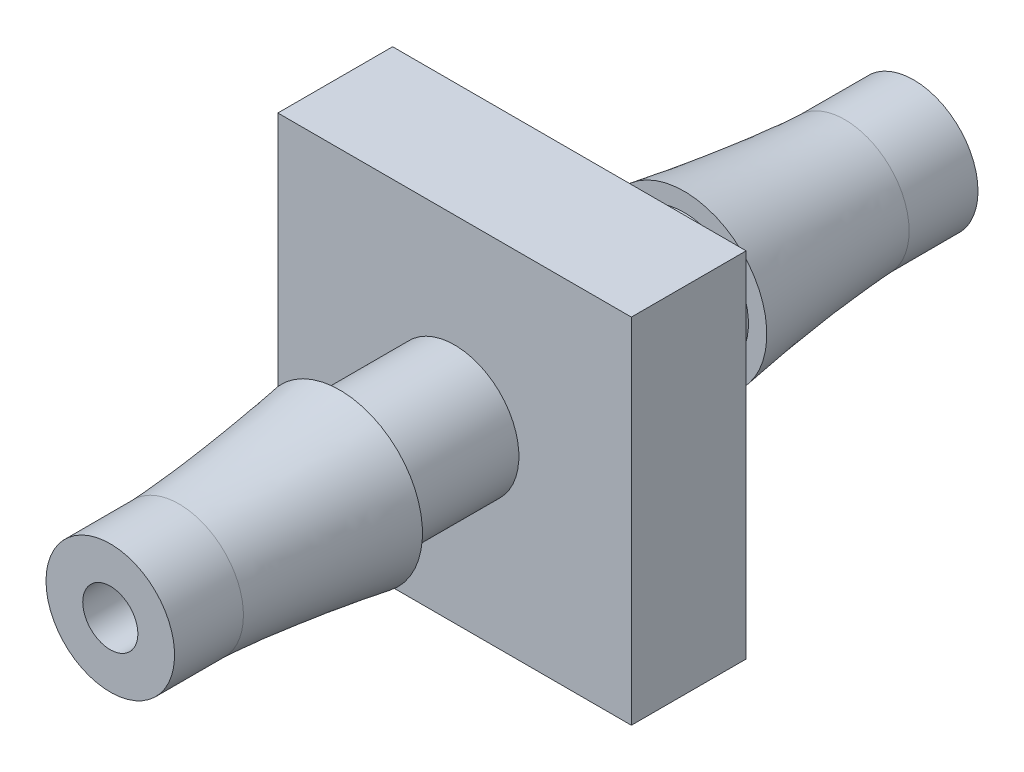
ISO-10303-21;
HEADER;
FILE_DESCRIPTION(('STEP AP214'),'2;1');
FILE_NAME('part.step','',(''),(''),'','','');
FILE_SCHEMA(('AUTOMOTIVE_DESIGN { 1 0 10303 214 1 1 1 1 }'));
ENDSEC;
DATA;
#1=APPLICATION_CONTEXT('core data for automotive mechanical design processes');
#2=APPLICATION_PROTOCOL_DEFINITION('international standard','automotive_design',2000,#1);
#3=PRODUCT_CONTEXT('',#1,'mechanical');
#4=PRODUCT('Part','Part','',(#3));
#5=PRODUCT_RELATED_PRODUCT_CATEGORY('part','',(#4));
#6=PRODUCT_DEFINITION_FORMATION('','',#4);
#7=PRODUCT_DEFINITION_CONTEXT('part definition',#1,'design');
#8=PRODUCT_DEFINITION('design','',#6,#7);
#9=PRODUCT_DEFINITION_SHAPE('','',#8);
#10=(LENGTH_UNIT() NAMED_UNIT(*) SI_UNIT(.MILLI.,.METRE.));
#11=(NAMED_UNIT(*) PLANE_ANGLE_UNIT() SI_UNIT($,.RADIAN.));
#12=(NAMED_UNIT(*) SI_UNIT($,.STERADIAN.) SOLID_ANGLE_UNIT());
#13=UNCERTAINTY_MEASURE_WITH_UNIT(LENGTH_MEASURE(1.E-05),#10,'distance_accuracy_value','');
#14=(GEOMETRIC_REPRESENTATION_CONTEXT(3) GLOBAL_UNCERTAINTY_ASSIGNED_CONTEXT((#13)) GLOBAL_UNIT_ASSIGNED_CONTEXT((#10,
#11,#12)) REPRESENTATION_CONTEXT('',''));
#15=CARTESIAN_POINT('',(0.,0.,0.));
#16=DIRECTION('',(0.,0.,1.));
#17=DIRECTION('',(1.,0.,0.));
#18=AXIS2_PLACEMENT_3D('',#15,#16,#17);
#19=CARTESIAN_POINT('',(0.,0.,10.));
#20=DIRECTION('',(0.,0.,-1.));
#21=DIRECTION('',(-1.,0.,0.));
#22=AXIS2_PLACEMENT_3D('',#19,#20,#21);
#23=CYLINDRICAL_SURFACE('',#22,1.4);
#24=CARTESIAN_POINT('',(0.,0.,2.5));
#25=DIRECTION('',(0.,0.,-1.));
#26=DIRECTION('',(-1.,0.,0.));
#27=AXIS2_PLACEMENT_3D('',#24,#25,#26);
#28=CIRCLE('',#27,1.4);
#29=CARTESIAN_POINT('',(-1.4,0.,2.5));
#30=VERTEX_POINT('',#29);
#31=EDGE_CURVE('E190',#30,#30,#28,.T.);
#32=ORIENTED_EDGE('',*,*,#31,.F.);
#33=EDGE_LOOP('',(#32));
#34=FACE_BOUND('',#33,.T.);
#35=CARTESIAN_POINT('',(0.,0.,5.));
#36=DIRECTION('',(0.,0.,1.));
#37=DIRECTION('',(1.,0.,0.));
#38=AXIS2_PLACEMENT_3D('',#35,#36,#37);
#39=CIRCLE('',#38,1.4);
#40=CARTESIAN_POINT('',(1.4,0.,5.));
#41=VERTEX_POINT('',#40);
#42=EDGE_CURVE('E43',#41,#41,#39,.F.);
#43=ORIENTED_EDGE('',*,*,#42,.T.);
#44=EDGE_LOOP('',(#43));
#45=FACE_BOUND('',#44,.T.);
#46=ADVANCED_FACE('F39',(#34,#45),#23,.T.);
#47=CARTESIAN_POINT('',(0.,0.,-7.5));
#48=DIRECTION('',(0.,0.,1.));
#49=DIRECTION('',(1.,0.,0.));
#50=AXIS2_PLACEMENT_3D('',#47,#48,#49);
#51=CYLINDRICAL_SURFACE('',#50,1.4);
#52=CARTESIAN_POINT('',(0.,0.,0.));
#53=DIRECTION('',(0.,0.,-1.));
#54=DIRECTION('',(-1.,0.,0.));
#55=AXIS2_PLACEMENT_3D('',#52,#53,#54);
#56=CIRCLE('',#55,1.4);
#57=CARTESIAN_POINT('',(-1.4,0.,0.));
#58=VERTEX_POINT('',#57);
#59=EDGE_CURVE('E118',#58,#58,#56,.T.);
#60=ORIENTED_EDGE('',*,*,#59,.T.);
#61=EDGE_LOOP('',(#60));
#62=FACE_BOUND('',#61,.T.);
#63=CARTESIAN_POINT('',(0.,0.,-2.5));
#64=DIRECTION('',(0.,0.,-1.));
#65=DIRECTION('',(-1.,0.,0.));
#66=AXIS2_PLACEMENT_3D('',#63,#64,#65);
#67=CIRCLE('',#66,1.4);
#68=CARTESIAN_POINT('',(-1.4,0.,-2.5));
#69=VERTEX_POINT('',#68);
#70=EDGE_CURVE('E49',#69,#69,#67,.T.);
#71=ORIENTED_EDGE('',*,*,#70,.F.);
#72=EDGE_LOOP('',(#71));
#73=FACE_BOUND('',#72,.T.);
#74=ADVANCED_FACE('F129',(#62,#73),#51,.T.);
#75=CARTESIAN_POINT('',(3.85,-3.85,2.5));
#76=DIRECTION('',(-1.,0.,0.));
#77=DIRECTION('',(0.,-1.,0.));
#78=AXIS2_PLACEMENT_3D('',#75,#76,#77);
#79=PLANE('',#78);
#80=DIRECTION('',(0.,1.,0.));
#81=VECTOR('',#80,1.);
#82=CARTESIAN_POINT('',(3.85,-3.85,0.));
#83=LINE('',#82,#81);
#84=CARTESIAN_POINT('',(3.85,-3.85,0.));
#85=VERTEX_POINT('',#84);
#86=CARTESIAN_POINT('',(3.85,3.85,0.));
#87=VERTEX_POINT('',#86);
#88=EDGE_CURVE('E108',#85,#87,#83,.T.);
#89=ORIENTED_EDGE('',*,*,#88,.T.);
#90=DIRECTION('',(0.,0.,-1.));
#91=VECTOR('',#90,1.);
#92=CARTESIAN_POINT('',(3.85,3.85,2.5));
#93=LINE('',#92,#91);
#94=CARTESIAN_POINT('',(3.85,3.85,2.5));
#95=VERTEX_POINT('',#94);
#96=EDGE_CURVE('E99',#95,#87,#93,.T.);
#97=ORIENTED_EDGE('',*,*,#96,.F.);
#98=DIRECTION('',(0.,1.,0.));
#99=VECTOR('',#98,1.);
#100=CARTESIAN_POINT('',(3.85,-3.85,2.5));
#101=LINE('',#100,#99);
#102=CARTESIAN_POINT('',(3.85,-3.85,2.5));
#103=VERTEX_POINT('',#102);
#104=EDGE_CURVE('E93',#103,#95,#101,.T.);
#105=ORIENTED_EDGE('',*,*,#104,.F.);
#106=DIRECTION('',(0.,0.,-1.));
#107=VECTOR('',#106,1.);
#108=CARTESIAN_POINT('',(3.85,-3.85,2.5));
#109=LINE('',#108,#107);
#110=EDGE_CURVE('E104',#103,#85,#109,.T.);
#111=ORIENTED_EDGE('',*,*,#110,.T.);
#112=EDGE_LOOP('',(#89,#97,#105,#111));
#113=FACE_BOUND('',#112,.T.);
#114=ADVANCED_FACE('F41',(#113),#79,.F.);
#115=CARTESIAN_POINT('',(-3.85,3.85,2.5));
#116=DIRECTION('',(0.,-1.,0.));
#117=DIRECTION('',(0.,0.,-1.));
#118=AXIS2_PLACEMENT_3D('',#115,#116,#117);
#119=PLANE('',#118);
#120=DIRECTION('',(-1.,0.,0.));
#121=VECTOR('',#120,1.);
#122=CARTESIAN_POINT('',(-3.85,3.85,0.));
#123=LINE('',#122,#121);
#124=CARTESIAN_POINT('',(-3.85,3.85,0.));
#125=VERTEX_POINT('',#124);
#126=EDGE_CURVE('E98',#87,#125,#123,.T.);
#127=ORIENTED_EDGE('',*,*,#126,.T.);
#128=DIRECTION('',(0.,0.,-1.));
#129=VECTOR('',#128,1.);
#130=CARTESIAN_POINT('',(-3.85,3.85,2.5));
#131=LINE('',#130,#129);
#132=CARTESIAN_POINT('',(-3.85,3.85,2.5));
#133=VERTEX_POINT('',#132);
#134=EDGE_CURVE('E96',#133,#125,#131,.T.);
#135=ORIENTED_EDGE('',*,*,#134,.F.);
#136=DIRECTION('',(-1.,0.,0.));
#137=VECTOR('',#136,1.);
#138=CARTESIAN_POINT('',(-3.85,3.85,2.5));
#139=LINE('',#138,#137);
#140=EDGE_CURVE('E88',#95,#133,#139,.T.);
#141=ORIENTED_EDGE('',*,*,#140,.F.);
#142=ORIENTED_EDGE('',*,*,#96,.T.);
#143=EDGE_LOOP('',(#127,#135,#141,#142));
#144=FACE_BOUND('',#143,.T.);
#145=ADVANCED_FACE('F97',(#144),#119,.F.);
#146=CARTESIAN_POINT('',(-3.85,-3.85,2.5));
#147=DIRECTION('',(1.,0.,0.));
#148=DIRECTION('',(0.,0.,-1.));
#149=AXIS2_PLACEMENT_3D('',#146,#147,#148);
#150=PLANE('',#149);
#151=DIRECTION('',(0.,-1.,0.));
#152=VECTOR('',#151,1.);
#153=CARTESIAN_POINT('',(-3.85,-3.85,0.));
#154=LINE('',#153,#152);
#155=CARTESIAN_POINT('',(-3.85,-3.85,0.));
#156=VERTEX_POINT('',#155);
#157=EDGE_CURVE('E74',#125,#156,#154,.T.);
#158=ORIENTED_EDGE('',*,*,#157,.T.);
#159=DIRECTION('',(0.,0.,-1.));
#160=VECTOR('',#159,1.);
#161=CARTESIAN_POINT('',(-3.85,-3.85,2.5));
#162=LINE('',#161,#160);
#163=CARTESIAN_POINT('',(-3.85,-3.85,2.5));
#164=VERTEX_POINT('',#163);
#165=EDGE_CURVE('E100',#164,#156,#162,.T.);
#166=ORIENTED_EDGE('',*,*,#165,.F.);
#167=DIRECTION('',(0.,-1.,0.));
#168=VECTOR('',#167,1.);
#169=CARTESIAN_POINT('',(-3.85,-3.85,2.5));
#170=LINE('',#169,#168);
#171=EDGE_CURVE('E91',#133,#164,#170,.T.);
#172=ORIENTED_EDGE('',*,*,#171,.F.);
#173=ORIENTED_EDGE('',*,*,#134,.T.);
#174=EDGE_LOOP('',(#158,#166,#172,#173));
#175=FACE_BOUND('',#174,.T.);
#176=ADVANCED_FACE('F102',(#175),#150,.F.);
#177=CARTESIAN_POINT('',(-3.85,-3.85,2.5));
#178=DIRECTION('',(0.,1.,0.));
#179=DIRECTION('',(0.,0.,1.));
#180=AXIS2_PLACEMENT_3D('',#177,#178,#179);
#181=PLANE('',#180);
#182=DIRECTION('',(1.,0.,0.));
#183=VECTOR('',#182,1.);
#184=CARTESIAN_POINT('',(-3.85,-3.85,0.));
#185=LINE('',#184,#183);
#186=EDGE_CURVE('E80',#156,#85,#185,.T.);
#187=ORIENTED_EDGE('',*,*,#186,.T.);
#188=ORIENTED_EDGE('',*,*,#110,.F.);
#189=DIRECTION('',(1.,0.,0.));
#190=VECTOR('',#189,1.);
#191=CARTESIAN_POINT('',(-3.85,-3.85,2.5));
#192=LINE('',#191,#190);
#193=EDGE_CURVE('E57',#164,#103,#192,.T.);
#194=ORIENTED_EDGE('',*,*,#193,.F.);
#195=ORIENTED_EDGE('',*,*,#165,.T.);
#196=EDGE_LOOP('',(#187,#188,#194,#195));
#197=FACE_BOUND('',#196,.T.);
#198=ADVANCED_FACE('F146',(#197),#181,.F.);
#199=CARTESIAN_POINT('',(0.,0.,2.5));
#200=DIRECTION('',(0.,0.,-1.));
#201=DIRECTION('',(-1.,0.,0.));
#202=AXIS2_PLACEMENT_3D('',#199,#200,#201);
#203=PLANE('',#202);
#204=ORIENTED_EDGE('',*,*,#31,.T.);
#205=EDGE_LOOP('',(#204));
#206=FACE_BOUND('',#205,.T.);
#207=ORIENTED_EDGE('',*,*,#104,.T.);
#208=ORIENTED_EDGE('',*,*,#140,.T.);
#209=ORIENTED_EDGE('',*,*,#171,.T.);
#210=ORIENTED_EDGE('',*,*,#193,.T.);
#211=EDGE_LOOP('',(#207,#208,#209,#210));
#212=FACE_BOUND('',#211,.T.);
#213=ADVANCED_FACE('F89',(#206,#212),#203,.F.);
#214=CARTESIAN_POINT('',(0.,0.,0.));
#215=DIRECTION('',(0.,0.,-1.));
#216=DIRECTION('',(-1.,0.,0.));
#217=AXIS2_PLACEMENT_3D('',#214,#215,#216);
#218=PLANE('',#217);
#219=ORIENTED_EDGE('',*,*,#59,.F.);
#220=EDGE_LOOP('',(#219));
#221=FACE_BOUND('',#220,.T.);
#222=ORIENTED_EDGE('',*,*,#88,.F.);
#223=ORIENTED_EDGE('',*,*,#186,.F.);
#224=ORIENTED_EDGE('',*,*,#157,.F.);
#225=ORIENTED_EDGE('',*,*,#126,.F.);
#226=EDGE_LOOP('',(#222,#223,#224,#225));
#227=FACE_BOUND('',#226,.T.);
#228=ADVANCED_FACE('F145',(#221,#227),#218,.T.);
#229=CARTESIAN_POINT('',(0.,0.,-2.5));
#230=DIRECTION('',(0.,0.,-1.));
#231=DIRECTION('',(-1.,0.,0.));
#232=AXIS2_PLACEMENT_3D('',#229,#230,#231);
#233=PLANE('',#232);
#234=ORIENTED_EDGE('',*,*,#70,.T.);
#235=EDGE_LOOP('',(#234));
#236=FACE_BOUND('',#235,.T.);
#237=CARTESIAN_POINT('',(0.,0.,-2.5));
#238=DIRECTION('',(0.,0.,-1.));
#239=DIRECTION('',(-1.,0.,0.));
#240=AXIS2_PLACEMENT_3D('',#237,#238,#239);
#241=CIRCLE('',#240,1.8);
#242=CARTESIAN_POINT('',(-1.8,0.,-2.5));
#243=VERTEX_POINT('',#242);
#244=EDGE_CURVE('E189',#243,#243,#241,.T.);
#245=ORIENTED_EDGE('',*,*,#244,.F.);
#246=EDGE_LOOP('',(#245));
#247=FACE_BOUND('',#246,.T.);
#248=ADVANCED_FACE('F150',(#236,#247),#233,.F.);
#249=CARTESIAN_POINT('',(-0.338397240311367,1.7679047790392,-2.5));
#250=CARTESIAN_POINT('',(-0.867767345215347,1.09862633983439,-6.));
#251=CARTESIAN_POINT('',(3.19741231776704,2.44469925966194,-2.5));
#252=CARTESIAN_POINT('',(1.32948533445343,2.83416103026508,-6.));
#253=CARTESIAN_POINT('',(3.87420679838977,-1.09111029841647,-2.5));
#254=CARTESIAN_POINT('',(3.06502002488413,0.636908350596305,-6.));
#255=CARTESIAN_POINT('',(0.338397240311367,-1.7679047790392,-2.5));
#256=CARTESIAN_POINT('',(0.867767345215347,-1.09862633983439,-6.));
#257=CARTESIAN_POINT('',(-3.19741231776704,-2.44469925966194,-2.5));
#258=CARTESIAN_POINT('',(-1.32948533445343,-2.83416103026508,-6.));
#259=CARTESIAN_POINT('',(-3.87420679838977,1.09111029841647,-2.5));
#260=CARTESIAN_POINT('',(-3.06502002488413,-0.636908350596304,-6.));
#261=CARTESIAN_POINT('',(-0.338397240311367,1.7679047790392,-2.5));
#262=CARTESIAN_POINT('',(-0.867767345215347,1.09862633983439,-6.));
#263=(BOUNDED_SURFACE() B_SPLINE_SURFACE(3,1,((#249,#250),(#251,#252),(#253,#254),(#255,#256),
(#257,#258),(#259,#260),(#261,#262)),.UNSPECIFIED.,.T.,.F.,.F.) B_SPLINE_SURFACE_WITH_KNOTS((4,
3,4),(2,2),(0.,0.5,1.),(0.,1.),
.UNSPECIFIED.) GEOMETRIC_REPRESENTATION_ITEM() RATIONAL_B_SPLINE_SURFACE(((1.,1.),
(0.333333333333333,0.333333333333333),(0.333333333333333,0.333333333333333),(1.,1.),
(0.333333333333333,0.333333333333333),(0.333333333333333,0.333333333333333),(1.,1.))) REPRESENTATION_ITEM('') SURFACE());
#264=CARTESIAN_POINT('',(-0.867767345215346,1.09862633983439,-5.99999999999999));
#265=CARTESIAN_POINT('',(-3.06502002488413,-0.6369083505963,-5.99999999999999));
#266=CARTESIAN_POINT('',(-1.32948533445344,-2.83416103026508,-5.99999999999999));
#267=CARTESIAN_POINT('',(0.867767345215346,-1.09862633983439,-5.99999999999999));
#268=CARTESIAN_POINT('',(3.06502002488413,0.6369083505963,-5.99999999999999));
#269=CARTESIAN_POINT('',(1.32948533445344,2.83416103026508,-5.99999999999999));
#270=CARTESIAN_POINT('',(-0.867767345215346,1.09862633983439,-5.99999999999999));
#271=(BOUNDED_CURVE() B_SPLINE_CURVE(3,(#264,#265,#266,#267,#268,#269,#270),.UNSPECIFIED.,.T.,
.F.) B_SPLINE_CURVE_WITH_KNOTS((4,3,4),(0.,0.5,1.),
.UNSPECIFIED.) CURVE() GEOMETRIC_REPRESENTATION_ITEM() RATIONAL_B_SPLINE_CURVE((1.,
0.333333333333333,0.333333333333333,1.,0.333333333333333,0.333333333333333,1.)) REPRESENTATION_ITEM(''));
#272=CARTESIAN_POINT('',(1.4,0.,-5.99999999999999));
#273=VERTEX_POINT('',#272);
#274=EDGE_CURVE('E123',#273,#273,#271,.T.);
#275=ORIENTED_EDGE('',*,*,#244,.T.);
#276=EDGE_LOOP('',(#275));
#277=FACE_BOUND('',#276,.T.);
#278=ORIENTED_EDGE('',*,*,#274,.T.);
#279=EDGE_LOOP('',(#278));
#280=FACE_BOUND('',#279,.T.);
#281=ADVANCED_FACE('F207',(#277,#280),#263,.T.);
#282=CARTESIAN_POINT('',(0.,0.,-7.5));
#283=DIRECTION('',(0.,0.,-1.));
#284=DIRECTION('',(-1.,0.,0.));
#285=AXIS2_PLACEMENT_3D('',#282,#283,#284);
#286=PLANE('',#285);
#287=CARTESIAN_POINT('',(0.,0.,-7.5));
#288=DIRECTION('',(0.,0.,-1.));
#289=DIRECTION('',(-1.,0.,0.));
#290=AXIS2_PLACEMENT_3D('',#287,#288,#289);
#291=CIRCLE('',#290,0.6);
#292=CARTESIAN_POINT('',(-0.6,0.,-7.5));
#293=VERTEX_POINT('',#292);
#294=EDGE_CURVE('E401',#293,#293,#291,.T.);
#295=ORIENTED_EDGE('',*,*,#294,.F.);
#296=EDGE_LOOP('',(#295));
#297=FACE_BOUND('',#296,.T.);
#298=CARTESIAN_POINT('',(0.,0.,-7.5));
#299=DIRECTION('',(0.,0.,-1.));
#300=DIRECTION('',(-1.,0.,0.));
#301=AXIS2_PLACEMENT_3D('',#298,#299,#300);
#302=CIRCLE('',#301,1.4);
#303=CARTESIAN_POINT('',(-1.4,0.,-7.5));
#304=VERTEX_POINT('',#303);
#305=EDGE_CURVE('E111',#304,#304,#302,.T.);
#306=ORIENTED_EDGE('',*,*,#305,.T.);
#307=EDGE_LOOP('',(#306));
#308=FACE_BOUND('',#307,.T.);
#309=ADVANCED_FACE('F141',(#297,#308),#286,.T.);
#310=ORIENTED_EDGE('',*,*,#305,.F.);
#311=EDGE_LOOP('',(#310));
#312=FACE_BOUND('',#311,.T.);
#313=ORIENTED_EDGE('',*,*,#274,.F.);
#314=EDGE_LOOP('',(#313));
#315=FACE_BOUND('',#314,.T.);
#316=ADVANCED_FACE('F140',(#312,#315),#51,.T.);
#317=CARTESIAN_POINT('',(0.,0.,5.));
#318=DIRECTION('',(0.,0.,1.));
#319=DIRECTION('',(-1.,0.,0.));
#320=AXIS2_PLACEMENT_3D('',#317,#318,#319);
#321=PLANE('',#320);
#322=ORIENTED_EDGE('',*,*,#42,.F.);
#323=EDGE_LOOP('',(#322));
#324=FACE_BOUND('',#323,.T.);
#325=CARTESIAN_POINT('',(0.,0.,5.));
#326=DIRECTION('',(0.,0.,-1.));
#327=DIRECTION('',(-1.,0.,0.));
#328=AXIS2_PLACEMENT_3D('',#325,#326,#327);
#329=CIRCLE('',#328,1.8);
#330=CARTESIAN_POINT('',(-1.8,0.,5.));
#331=VERTEX_POINT('',#330);
#332=EDGE_CURVE('E390',#331,#331,#329,.T.);
#333=ORIENTED_EDGE('',*,*,#332,.T.);
#334=EDGE_LOOP('',(#333));
#335=FACE_BOUND('',#334,.T.);
#336=ADVANCED_FACE('F276',(#324,#335),#321,.F.);
#337=CARTESIAN_POINT('',(-0.338397240311367,1.7679047790392,5.));
#338=CARTESIAN_POINT('',(-0.867767345215347,1.09862633983439,8.5));
#339=CARTESIAN_POINT('',(3.19741231776704,2.44469925966194,5.));
#340=CARTESIAN_POINT('',(1.32948533445343,2.83416103026508,8.5));
#341=CARTESIAN_POINT('',(3.87420679838977,-1.09111029841647,5.));
#342=CARTESIAN_POINT('',(3.06502002488413,0.636908350596305,8.5));
#343=CARTESIAN_POINT('',(0.338397240311367,-1.7679047790392,5.));
#344=CARTESIAN_POINT('',(0.867767345215347,-1.09862633983439,8.5));
#345=CARTESIAN_POINT('',(-3.19741231776704,-2.44469925966194,5.));
#346=CARTESIAN_POINT('',(-1.32948533445343,-2.83416103026508,8.5));
#347=CARTESIAN_POINT('',(-3.87420679838977,1.09111029841647,5.));
#348=CARTESIAN_POINT('',(-3.06502002488413,-0.636908350596304,8.5));
#349=CARTESIAN_POINT('',(-0.338397240311367,1.7679047790392,5.));
#350=CARTESIAN_POINT('',(-0.867767345215347,1.09862633983439,8.5));
#351=(BOUNDED_SURFACE() B_SPLINE_SURFACE(3,1,((#337,#338),(#339,#340),(#341,#342),(#343,#344),
(#345,#346),(#347,#348),(#349,#350)),.UNSPECIFIED.,.T.,.F.,.F.) B_SPLINE_SURFACE_WITH_KNOTS((4,
3,4),(2,2),(0.,0.5,1.),(0.,1.),
.UNSPECIFIED.) GEOMETRIC_REPRESENTATION_ITEM() RATIONAL_B_SPLINE_SURFACE(((1.,1.),
(0.333333333333333,0.333333333333333),(0.333333333333333,0.333333333333333),(1.,1.),
(0.333333333333333,0.333333333333333),(0.333333333333333,0.333333333333333),(1.,1.))) REPRESENTATION_ITEM('') SURFACE());
#352=CARTESIAN_POINT('',(-0.867767345215346,1.09862633983439,8.49999999999999));
#353=CARTESIAN_POINT('',(1.32948533445344,2.83416103026508,8.49999999999999));
#354=CARTESIAN_POINT('',(3.06502002488413,0.6369083505963,8.49999999999999));
#355=CARTESIAN_POINT('',(0.867767345215346,-1.09862633983439,8.49999999999999));
#356=CARTESIAN_POINT('',(-1.32948533445344,-2.83416103026508,8.49999999999999));
#357=CARTESIAN_POINT('',(-3.06502002488413,-0.6369083505963,8.49999999999999));
#358=CARTESIAN_POINT('',(-0.867767345215346,1.09862633983439,8.49999999999999));
#359=(BOUNDED_CURVE() B_SPLINE_CURVE(3,(#352,#353,#354,#355,#356,#357,#358),.UNSPECIFIED.,.T.,
.F.) B_SPLINE_CURVE_WITH_KNOTS((4,3,4),(0.,0.5,1.),
.UNSPECIFIED.) CURVE() GEOMETRIC_REPRESENTATION_ITEM() RATIONAL_B_SPLINE_CURVE((1.,
0.333333333333333,0.333333333333333,1.,0.333333333333333,0.333333333333333,1.)) REPRESENTATION_ITEM(''));
#360=CARTESIAN_POINT('',(1.4,0.,8.49999999999999));
#361=VERTEX_POINT('',#360);
#362=EDGE_CURVE('E12',#361,#361,#359,.T.);
#363=ORIENTED_EDGE('',*,*,#332,.F.);
#364=EDGE_LOOP('',(#363));
#365=FACE_BOUND('',#364,.T.);
#366=ORIENTED_EDGE('',*,*,#362,.T.);
#367=EDGE_LOOP('',(#366));
#368=FACE_BOUND('',#367,.T.);
#369=ADVANCED_FACE('F181',(#365,#368),#351,.F.);
#370=CARTESIAN_POINT('',(0.,0.,10.));
#371=DIRECTION('',(0.,0.,1.));
#372=DIRECTION('',(-1.,0.,0.));
#373=AXIS2_PLACEMENT_3D('',#370,#371,#372);
#374=PLANE('',#373);
#375=CARTESIAN_POINT('',(0.,0.,10.));
#376=DIRECTION('',(0.,0.,-1.));
#377=DIRECTION('',(-1.,0.,0.));
#378=AXIS2_PLACEMENT_3D('',#375,#376,#377);
#379=CIRCLE('',#378,0.6);
#380=CARTESIAN_POINT('',(-0.6,0.,10.));
#381=VERTEX_POINT('',#380);
#382=EDGE_CURVE('E398',#381,#381,#379,.T.);
#383=ORIENTED_EDGE('',*,*,#382,.T.);
#384=EDGE_LOOP('',(#383));
#385=FACE_BOUND('',#384,.T.);
#386=CARTESIAN_POINT('',(0.,0.,10.));
#387=DIRECTION('',(0.,0.,-1.));
#388=DIRECTION('',(-1.,0.,0.));
#389=AXIS2_PLACEMENT_3D('',#386,#387,#388);
#390=CIRCLE('',#389,1.4);
#391=CARTESIAN_POINT('',(-1.4,0.,10.));
#392=VERTEX_POINT('',#391);
#393=EDGE_CURVE('E187',#392,#392,#390,.T.);
#394=ORIENTED_EDGE('',*,*,#393,.F.);
#395=EDGE_LOOP('',(#394));
#396=FACE_BOUND('',#395,.T.);
#397=ADVANCED_FACE('F173',(#385,#396),#374,.T.);
#398=ORIENTED_EDGE('',*,*,#362,.F.);
#399=EDGE_LOOP('',(#398));
#400=FACE_BOUND('',#399,.T.);
#401=ORIENTED_EDGE('',*,*,#393,.T.);
#402=EDGE_LOOP('',(#401));
#403=FACE_BOUND('',#402,.T.);
#404=ADVANCED_FACE('F163',(#400,#403),#23,.T.);
#405=CARTESIAN_POINT('',(0.,0.,10.));
#406=DIRECTION('',(0.,0.,-1.));
#407=DIRECTION('',(-1.,0.,0.));
#408=AXIS2_PLACEMENT_3D('',#405,#406,#407);
#409=CYLINDRICAL_SURFACE('',#408,0.6);
#410=ORIENTED_EDGE('',*,*,#382,.F.);
#411=EDGE_LOOP('',(#410));
#412=FACE_BOUND('',#411,.T.);
#413=ORIENTED_EDGE('',*,*,#294,.T.);
#414=EDGE_LOOP('',(#413));
#415=FACE_BOUND('',#414,.T.);
#416=ADVANCED_FACE('F172',(#412,#415),#409,.F.);
#417=CLOSED_SHELL('',(#46,#74,#114,#145,#176,#198,#213,#228,#248,#281,#309,#316,#336,#369,#397,
#404,#416));
#418=MANIFOLD_SOLID_BREP('B2',#417);
#419=ADVANCED_BREP_SHAPE_REPRESENTATION('',(#18,#418),#14);
#420=SHAPE_DEFINITION_REPRESENTATION(#9,#419);
ENDSEC;
END-ISO-10303-21;
